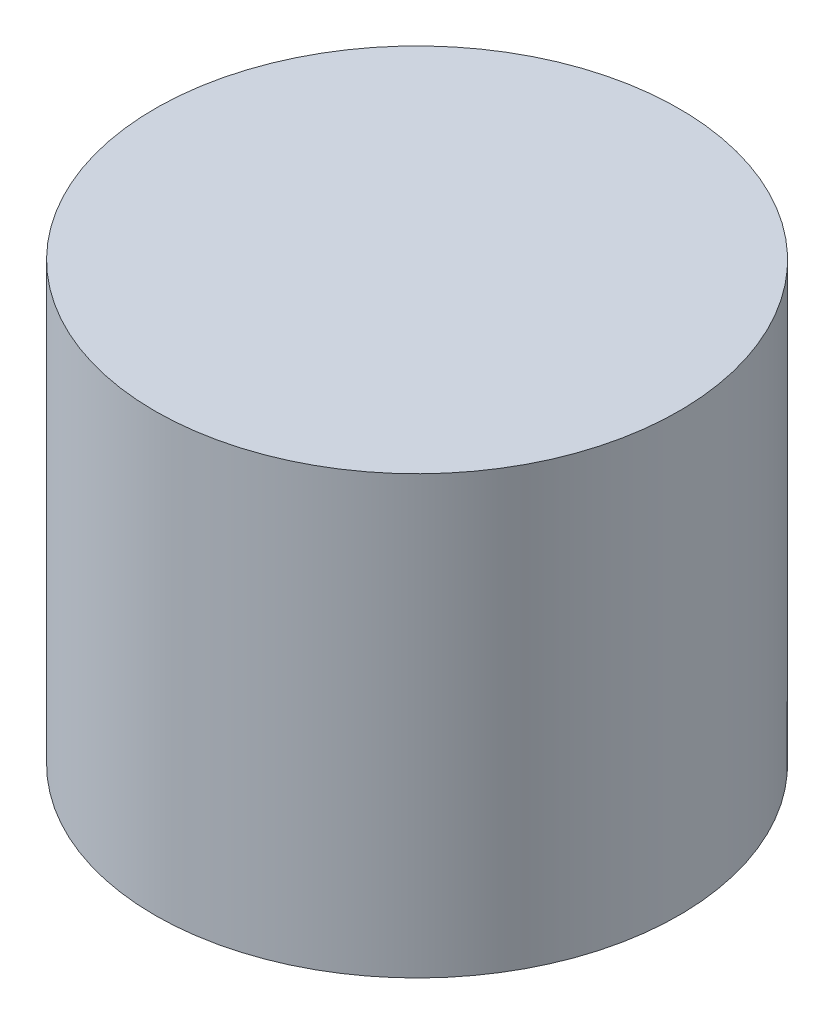
ISO-10303-21;
HEADER;
FILE_DESCRIPTION(('STEP AP214'),'2;1');
FILE_NAME('part.step','',(''),(''),'','','');
FILE_SCHEMA(('AUTOMOTIVE_DESIGN { 1 0 10303 214 1 1 1 1 }'));
ENDSEC;
DATA;
#1=APPLICATION_CONTEXT('core data for automotive mechanical design processes');
#2=APPLICATION_PROTOCOL_DEFINITION('international standard','automotive_design',2000,#1);
#3=PRODUCT_CONTEXT('',#1,'mechanical');
#4=PRODUCT('Part','Part','',(#3));
#5=PRODUCT_RELATED_PRODUCT_CATEGORY('part','',(#4));
#6=PRODUCT_DEFINITION_FORMATION('','',#4);
#7=PRODUCT_DEFINITION_CONTEXT('part definition',#1,'design');
#8=PRODUCT_DEFINITION('design','',#6,#7);
#9=PRODUCT_DEFINITION_SHAPE('','',#8);
#10=(LENGTH_UNIT() NAMED_UNIT(*) SI_UNIT(.MILLI.,.METRE.));
#11=(NAMED_UNIT(*) PLANE_ANGLE_UNIT() SI_UNIT($,.RADIAN.));
#12=(NAMED_UNIT(*) SI_UNIT($,.STERADIAN.) SOLID_ANGLE_UNIT());
#13=UNCERTAINTY_MEASURE_WITH_UNIT(LENGTH_MEASURE(1.E-05),#10,'distance_accuracy_value','');
#14=(GEOMETRIC_REPRESENTATION_CONTEXT(3) GLOBAL_UNCERTAINTY_ASSIGNED_CONTEXT((#13)) GLOBAL_UNIT_ASSIGNED_CONTEXT((#10,
#11,#12)) REPRESENTATION_CONTEXT('',''));
#15=CARTESIAN_POINT('',(0.,0.,0.));
#16=DIRECTION('',(0.,0.,1.));
#17=DIRECTION('',(1.,0.,0.));
#18=AXIS2_PLACEMENT_3D('',#15,#16,#17);
#19=CARTESIAN_POINT('',(0.,10.,0.));
#20=DIRECTION('',(0.,-1.,0.));
#21=DIRECTION('',(0.,0.,-1.));
#22=AXIS2_PLACEMENT_3D('',#19,#20,#21);
#23=CYLINDRICAL_SURFACE('',#22,6.);
#24=CARTESIAN_POINT('',(0.,10.,0.));
#25=DIRECTION('',(0.,1.,0.));
#26=DIRECTION('',(0.,0.,1.));
#27=AXIS2_PLACEMENT_3D('',#24,#25,#26);
#28=CIRCLE('',#27,6.);
#29=CARTESIAN_POINT('',(0.,10.,6.));
#30=VERTEX_POINT('',#29);
#31=EDGE_CURVE('E10',#30,#30,#28,.T.);
#32=ORIENTED_EDGE('',*,*,#31,.F.);
#33=EDGE_LOOP('',(#32));
#34=FACE_BOUND('',#33,.T.);
#35=CARTESIAN_POINT('',(0.,0.,0.));
#36=DIRECTION('',(0.,1.,0.));
#37=DIRECTION('',(0.,0.,1.));
#38=AXIS2_PLACEMENT_3D('',#35,#36,#37);
#39=CIRCLE('',#38,6.);
#40=CARTESIAN_POINT('',(0.,0.,6.));
#41=VERTEX_POINT('',#40);
#42=EDGE_CURVE('E34',#41,#41,#39,.T.);
#43=ORIENTED_EDGE('',*,*,#42,.T.);
#44=EDGE_LOOP('',(#43));
#45=FACE_BOUND('',#44,.T.);
#46=ADVANCED_FACE('F31',(#34,#45),#23,.T.);
#47=CARTESIAN_POINT('',(0.,10.,0.));
#48=DIRECTION('',(0.,1.,0.));
#49=DIRECTION('',(0.,0.,1.));
#50=AXIS2_PLACEMENT_3D('',#47,#48,#49);
#51=PLANE('',#50);
#52=ORIENTED_EDGE('',*,*,#31,.T.);
#53=EDGE_LOOP('',(#52));
#54=FACE_BOUND('',#53,.T.);
#55=ADVANCED_FACE('F60',(#54),#51,.T.);
#56=CARTESIAN_POINT('',(0.,0.,0.));
#57=DIRECTION('',(0.,1.,0.));
#58=DIRECTION('',(0.,0.,1.));
#59=AXIS2_PLACEMENT_3D('',#56,#57,#58);
#60=PLANE('',#59);
#61=CARTESIAN_POINT('',(0.,0.,0.));
#62=DIRECTION('',(0.,-1.,0.));
#63=DIRECTION('',(0.,0.,-1.));
#64=AXIS2_PLACEMENT_3D('',#61,#62,#63);
#65=CIRCLE('',#64,1.);
#66=CARTESIAN_POINT('',(0.,0.,-1.));
#67=VERTEX_POINT('',#66);
#68=EDGE_CURVE('E43',#67,#67,#65,.T.);
#69=ORIENTED_EDGE('',*,*,#68,.F.);
#70=EDGE_LOOP('',(#69));
#71=FACE_BOUND('',#70,.T.);
#72=ORIENTED_EDGE('',*,*,#42,.F.);
#73=EDGE_LOOP('',(#72));
#74=FACE_BOUND('',#73,.T.);
#75=ADVANCED_FACE('F54',(#71,#74),#60,.F.);
#76=CARTESIAN_POINT('',(0.,2.,0.));
#77=DIRECTION('',(0.,-1.,0.));
#78=DIRECTION('',(0.,0.,-1.));
#79=AXIS2_PLACEMENT_3D('',#76,#77,#78);
#80=CYLINDRICAL_SURFACE('',#79,1.);
#81=CARTESIAN_POINT('',(0.,2.,0.));
#82=DIRECTION('',(0.,-1.,0.));
#83=DIRECTION('',(0.,0.,-1.));
#84=AXIS2_PLACEMENT_3D('',#81,#82,#83);
#85=CIRCLE('',#84,1.);
#86=CARTESIAN_POINT('',(0.,2.,-1.));
#87=VERTEX_POINT('',#86);
#88=EDGE_CURVE('E41',#87,#87,#85,.T.);
#89=ORIENTED_EDGE('',*,*,#88,.F.);
#90=EDGE_LOOP('',(#89));
#91=FACE_BOUND('',#90,.T.);
#92=ORIENTED_EDGE('',*,*,#68,.T.);
#93=EDGE_LOOP('',(#92));
#94=FACE_BOUND('',#93,.T.);
#95=ADVANCED_FACE('F51',(#91,#94),#80,.F.);
#96=CARTESIAN_POINT('',(0.,2.,0.));
#97=DIRECTION('',(0.,-1.,0.));
#98=DIRECTION('',(0.,0.,-1.));
#99=AXIS2_PLACEMENT_3D('',#96,#97,#98);
#100=PLANE('',#99);
#101=ORIENTED_EDGE('',*,*,#88,.T.);
#102=EDGE_LOOP('',(#101));
#103=FACE_BOUND('',#102,.T.);
#104=ADVANCED_FACE('F49',(#103),#100,.T.);
#105=CLOSED_SHELL('',(#46,#55,#75,#95,#104));
#106=MANIFOLD_SOLID_BREP('B2',#105);
#107=ADVANCED_BREP_SHAPE_REPRESENTATION('',(#18,#106),#14);
#108=SHAPE_DEFINITION_REPRESENTATION(#9,#107);
ENDSEC;
END-ISO-10303-21;
